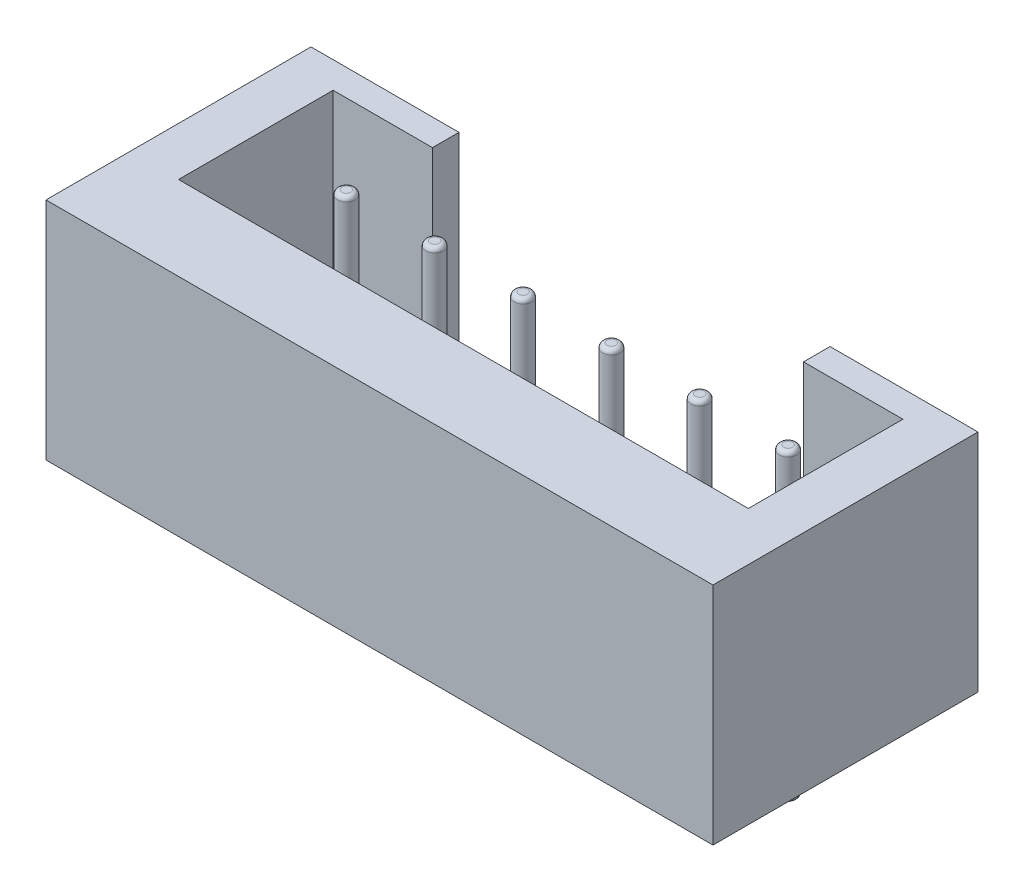
ISO-10303-21;
HEADER;
FILE_DESCRIPTION(('STEP AP214'),'2;1');
FILE_NAME('part.step','',(''),(''),'','','');
FILE_SCHEMA(('AUTOMOTIVE_DESIGN { 1 0 10303 214 1 1 1 1 }'));
ENDSEC;
DATA;
#1=APPLICATION_CONTEXT('core data for automotive mechanical design processes');
#2=APPLICATION_PROTOCOL_DEFINITION('international standard','automotive_design',2000,#1);
#3=PRODUCT_CONTEXT('',#1,'mechanical');
#4=PRODUCT('Part','Part','',(#3));
#5=PRODUCT_RELATED_PRODUCT_CATEGORY('part','',(#4));
#6=PRODUCT_DEFINITION_FORMATION('','',#4);
#7=PRODUCT_DEFINITION_CONTEXT('part definition',#1,'design');
#8=PRODUCT_DEFINITION('design','',#6,#7);
#9=PRODUCT_DEFINITION_SHAPE('','',#8);
#10=(LENGTH_UNIT() NAMED_UNIT(*) SI_UNIT(.MILLI.,.METRE.));
#11=(NAMED_UNIT(*) PLANE_ANGLE_UNIT() SI_UNIT($,.RADIAN.));
#12=(NAMED_UNIT(*) SI_UNIT($,.STERADIAN.) SOLID_ANGLE_UNIT());
#13=UNCERTAINTY_MEASURE_WITH_UNIT(LENGTH_MEASURE(1.E-05),#10,'distance_accuracy_value','');
#14=(GEOMETRIC_REPRESENTATION_CONTEXT(3) GLOBAL_UNCERTAINTY_ASSIGNED_CONTEXT((#13)) GLOBAL_UNIT_ASSIGNED_CONTEXT((#10,
#11,#12)) REPRESENTATION_CONTEXT('',''));
#15=CARTESIAN_POINT('',(0.,0.,0.));
#16=DIRECTION('',(0.,0.,1.));
#17=DIRECTION('',(1.,0.,0.));
#18=AXIS2_PLACEMENT_3D('',#15,#16,#17);
#19=CARTESIAN_POINT('',(-7.55,0.6,-3.));
#20=DIRECTION('',(1.,0.,0.));
#21=DIRECTION('',(0.,0.,-1.));
#22=AXIS2_PLACEMENT_3D('',#19,#20,#21);
#23=PLANE('',#22);
#24=DIRECTION('',(0.,0.,1.));
#25=VECTOR('',#24,1.);
#26=CARTESIAN_POINT('',(-7.55,0.,-3.));
#27=LINE('',#26,#25);
#28=CARTESIAN_POINT('',(-7.55,0.,-3.));
#29=VERTEX_POINT('',#28);
#30=CARTESIAN_POINT('',(-7.55,0.,3.));
#31=VERTEX_POINT('',#30);
#32=EDGE_CURVE('E220',#29,#31,#27,.T.);
#33=ORIENTED_EDGE('',*,*,#32,.T.);
#34=DIRECTION('',(0.,-1.,0.));
#35=VECTOR('',#34,1.);
#36=CARTESIAN_POINT('',(-7.55,0.6,3.));
#37=LINE('',#36,#35);
#38=CARTESIAN_POINT('',(-7.55,5.1,3.));
#39=VERTEX_POINT('',#38);
#40=EDGE_CURVE('E265',#39,#31,#37,.T.);
#41=ORIENTED_EDGE('',*,*,#40,.F.);
#42=DIRECTION('',(0.,0.,1.));
#43=VECTOR('',#42,1.);
#44=CARTESIAN_POINT('',(-7.55,5.1,0.));
#45=LINE('',#44,#43);
#46=CARTESIAN_POINT('',(-7.55,5.1,-3.));
#47=VERTEX_POINT('',#46);
#48=EDGE_CURVE('E194',#47,#39,#45,.T.);
#49=ORIENTED_EDGE('',*,*,#48,.F.);
#50=DIRECTION('',(0.,-1.,0.));
#51=VECTOR('',#50,1.);
#52=CARTESIAN_POINT('',(-7.55,0.6,-3.));
#53=LINE('',#52,#51);
#54=EDGE_CURVE('E269',#47,#29,#53,.T.);
#55=ORIENTED_EDGE('',*,*,#54,.T.);
#56=EDGE_LOOP('',(#33,#41,#49,#55));
#57=FACE_BOUND('',#56,.T.);
#58=ADVANCED_FACE('F45',(#57),#23,.F.);
#59=CARTESIAN_POINT('',(-7.55,0.6,3.));
#60=DIRECTION('',(0.,0.,-1.));
#61=DIRECTION('',(-1.,0.,0.));
#62=AXIS2_PLACEMENT_3D('',#59,#60,#61);
#63=PLANE('',#62);
#64=DIRECTION('',(1.,0.,0.));
#65=VECTOR('',#64,1.);
#66=CARTESIAN_POINT('',(-7.55,0.,3.));
#67=LINE('',#66,#65);
#68=CARTESIAN_POINT('',(7.55,0.,3.));
#69=VERTEX_POINT('',#68);
#70=EDGE_CURVE('E250',#31,#69,#67,.T.);
#71=ORIENTED_EDGE('',*,*,#70,.T.);
#72=DIRECTION('',(0.,-1.,0.));
#73=VECTOR('',#72,1.);
#74=CARTESIAN_POINT('',(7.55,0.6,3.));
#75=LINE('',#74,#73);
#76=CARTESIAN_POINT('',(7.55,5.1,3.));
#77=VERTEX_POINT('',#76);
#78=EDGE_CURVE('E261',#77,#69,#75,.T.);
#79=ORIENTED_EDGE('',*,*,#78,.F.);
#80=DIRECTION('',(1.,0.,0.));
#81=VECTOR('',#80,1.);
#82=CARTESIAN_POINT('',(0.,5.1,3.));
#83=LINE('',#82,#81);
#84=EDGE_CURVE('E190',#39,#77,#83,.T.);
#85=ORIENTED_EDGE('',*,*,#84,.F.);
#86=ORIENTED_EDGE('',*,*,#40,.T.);
#87=EDGE_LOOP('',(#71,#79,#85,#86));
#88=FACE_BOUND('',#87,.T.);
#89=ADVANCED_FACE('F400',(#88),#63,.F.);
#90=CARTESIAN_POINT('',(7.55,0.6,-3.));
#91=DIRECTION('',(-1.,0.,0.));
#92=DIRECTION('',(0.,0.,1.));
#93=AXIS2_PLACEMENT_3D('',#90,#91,#92);
#94=PLANE('',#93);
#95=DIRECTION('',(0.,0.,-1.));
#96=VECTOR('',#95,1.);
#97=CARTESIAN_POINT('',(7.55,0.,-3.));
#98=LINE('',#97,#96);
#99=CARTESIAN_POINT('',(7.55,0.,-3.));
#100=VERTEX_POINT('',#99);
#101=EDGE_CURVE('E253',#69,#100,#98,.T.);
#102=ORIENTED_EDGE('',*,*,#101,.T.);
#103=DIRECTION('',(0.,-1.,0.));
#104=VECTOR('',#103,1.);
#105=CARTESIAN_POINT('',(7.55,0.6,-3.));
#106=LINE('',#105,#104);
#107=CARTESIAN_POINT('',(7.55,5.1,-3.));
#108=VERTEX_POINT('',#107);
#109=EDGE_CURVE('E246',#108,#100,#106,.T.);
#110=ORIENTED_EDGE('',*,*,#109,.F.);
#111=DIRECTION('',(0.,0.,1.));
#112=VECTOR('',#111,1.);
#113=CARTESIAN_POINT('',(7.55,5.1,0.));
#114=LINE('',#113,#112);
#115=EDGE_CURVE('E186',#108,#77,#114,.T.);
#116=ORIENTED_EDGE('',*,*,#115,.T.);
#117=ORIENTED_EDGE('',*,*,#78,.T.);
#118=EDGE_LOOP('',(#102,#110,#116,#117));
#119=FACE_BOUND('',#118,.T.);
#120=ADVANCED_FACE('F406',(#119),#94,.F.);
#121=CARTESIAN_POINT('',(4.2,0.6,-3.));
#122=DIRECTION('',(0.,0.,1.));
#123=DIRECTION('',(1.,0.,0.));
#124=AXIS2_PLACEMENT_3D('',#121,#122,#123);
#125=PLANE('',#124);
#126=DIRECTION('',(-1.,0.,0.));
#127=VECTOR('',#126,1.);
#128=CARTESIAN_POINT('',(4.2,0.,-3.));
#129=LINE('',#128,#127);
#130=EDGE_CURVE('E247',#100,#29,#129,.T.);
#131=ORIENTED_EDGE('',*,*,#130,.T.);
#132=ORIENTED_EDGE('',*,*,#54,.F.);
#133=DIRECTION('',(1.,0.,0.));
#134=VECTOR('',#133,1.);
#135=CARTESIAN_POINT('',(0.,5.1,-3.));
#136=LINE('',#135,#134);
#137=CARTESIAN_POINT('',(-4.2,5.1,-3.));
#138=VERTEX_POINT('',#137);
#139=EDGE_CURVE('E141',#47,#138,#136,.T.);
#140=ORIENTED_EDGE('',*,*,#139,.T.);
#141=DIRECTION('',(0.,-1.,0.));
#142=VECTOR('',#141,1.);
#143=CARTESIAN_POINT('',(-4.2,5.1,-3.));
#144=LINE('',#143,#142);
#145=CARTESIAN_POINT('',(-4.2,0.6,-3.));
#146=VERTEX_POINT('',#145);
#147=EDGE_CURVE('E156',#138,#146,#144,.T.);
#148=ORIENTED_EDGE('',*,*,#147,.T.);
#149=DIRECTION('',(-1.,0.,0.));
#150=VECTOR('',#149,1.);
#151=CARTESIAN_POINT('',(-4.2,0.6,-3.));
#152=LINE('',#151,#150);
#153=CARTESIAN_POINT('',(4.2,0.6,-3.));
#154=VERTEX_POINT('',#153);
#155=EDGE_CURVE('E243',#154,#146,#152,.T.);
#156=ORIENTED_EDGE('',*,*,#155,.F.);
#157=DIRECTION('',(0.,-1.,0.));
#158=VECTOR('',#157,1.);
#159=CARTESIAN_POINT('',(4.2,5.1,-3.));
#160=LINE('',#159,#158);
#161=CARTESIAN_POINT('',(4.2,5.1,-3.));
#162=VERTEX_POINT('',#161);
#163=EDGE_CURVE('E221',#162,#154,#160,.T.);
#164=ORIENTED_EDGE('',*,*,#163,.F.);
#165=DIRECTION('',(1.,0.,0.));
#166=VECTOR('',#165,1.);
#167=CARTESIAN_POINT('',(0.,5.1,-3.));
#168=LINE('',#167,#166);
#169=EDGE_CURVE('E182',#162,#108,#168,.T.);
#170=ORIENTED_EDGE('',*,*,#169,.T.);
#171=ORIENTED_EDGE('',*,*,#109,.T.);
#172=EDGE_LOOP('',(#131,#132,#140,#148,#156,#164,#170,#171));
#173=FACE_BOUND('',#172,.T.);
#174=ADVANCED_FACE('F542',(#173),#125,.F.);
#175=CARTESIAN_POINT('',(0.,0.6,0.));
#176=DIRECTION('',(0.,-1.,0.));
#177=DIRECTION('',(0.,0.,-1.));
#178=AXIS2_PLACEMENT_3D('',#175,#176,#177);
#179=PLANE('',#178);
#180=CARTESIAN_POINT('',(5.05,0.6,-1.2));
#181=DIRECTION('',(0.,-1.,0.));
#182=DIRECTION('',(0.,0.,-1.));
#183=AXIS2_PLACEMENT_3D('',#180,#181,#182);
#184=CIRCLE('',#183,0.2);
#185=CARTESIAN_POINT('',(5.05,0.6,-1.4));
#186=VERTEX_POINT('',#185);
#187=EDGE_CURVE('E1119',#186,#186,#184,.T.);
#188=ORIENTED_EDGE('',*,*,#187,.T.);
#189=EDGE_LOOP('',(#188));
#190=FACE_BOUND('',#189,.T.);
#191=CARTESIAN_POINT('',(3.05,0.6,-1.2));
#192=DIRECTION('',(0.,-1.,0.));
#193=DIRECTION('',(0.,0.,-1.));
#194=AXIS2_PLACEMENT_3D('',#191,#192,#193);
#195=CIRCLE('',#194,0.2);
#196=CARTESIAN_POINT('',(3.05,0.6,-1.4));
#197=VERTEX_POINT('',#196);
#198=EDGE_CURVE('E1121',#197,#197,#195,.T.);
#199=ORIENTED_EDGE('',*,*,#198,.T.);
#200=EDGE_LOOP('',(#199));
#201=FACE_BOUND('',#200,.T.);
#202=CARTESIAN_POINT('',(1.05,0.6,-1.2));
#203=DIRECTION('',(0.,-1.,0.));
#204=DIRECTION('',(0.,0.,-1.));
#205=AXIS2_PLACEMENT_3D('',#202,#203,#204);
#206=CIRCLE('',#205,0.2);
#207=CARTESIAN_POINT('',(1.05,0.6,-1.4));
#208=VERTEX_POINT('',#207);
#209=EDGE_CURVE('E1125',#208,#208,#206,.T.);
#210=ORIENTED_EDGE('',*,*,#209,.T.);
#211=EDGE_LOOP('',(#210));
#212=FACE_BOUND('',#211,.T.);
#213=CARTESIAN_POINT('',(-0.950000000000003,0.6,-1.2));
#214=DIRECTION('',(0.,-1.,0.));
#215=DIRECTION('',(0.,0.,-1.));
#216=AXIS2_PLACEMENT_3D('',#213,#214,#215);
#217=CIRCLE('',#216,0.2);
#218=CARTESIAN_POINT('',(-0.950000000000003,0.6,-1.4));
#219=VERTEX_POINT('',#218);
#220=EDGE_CURVE('E1131',#219,#219,#217,.T.);
#221=ORIENTED_EDGE('',*,*,#220,.T.);
#222=EDGE_LOOP('',(#221));
#223=FACE_BOUND('',#222,.T.);
#224=CARTESIAN_POINT('',(-2.95,0.6,-1.2));
#225=DIRECTION('',(0.,-1.,0.));
#226=DIRECTION('',(0.,0.,-1.));
#227=AXIS2_PLACEMENT_3D('',#224,#225,#226);
#228=CIRCLE('',#227,0.2);
#229=CARTESIAN_POINT('',(-2.95,0.6,-1.4));
#230=VERTEX_POINT('',#229);
#231=EDGE_CURVE('E1134',#230,#230,#228,.T.);
#232=ORIENTED_EDGE('',*,*,#231,.T.);
#233=EDGE_LOOP('',(#232));
#234=FACE_BOUND('',#233,.T.);
#235=CARTESIAN_POINT('',(-4.95,0.6,-1.2));
#236=DIRECTION('',(0.,-1.,0.));
#237=DIRECTION('',(0.,0.,-1.));
#238=AXIS2_PLACEMENT_3D('',#235,#236,#237);
#239=CIRCLE('',#238,0.2);
#240=CARTESIAN_POINT('',(-4.95,0.6,-1.4));
#241=VERTEX_POINT('',#240);
#242=EDGE_CURVE('E165',#241,#241,#239,.T.);
#243=ORIENTED_EDGE('',*,*,#242,.T.);
#244=EDGE_LOOP('',(#243));
#245=FACE_BOUND('',#244,.T.);
#246=ORIENTED_EDGE('',*,*,#155,.T.);
#247=DIRECTION('',(0.,0.,1.));
#248=VECTOR('',#247,1.);
#249=CARTESIAN_POINT('',(-4.2,0.6,0.));
#250=LINE('',#249,#248);
#251=CARTESIAN_POINT('',(-4.2,0.6,-2.4));
#252=VERTEX_POINT('',#251);
#253=EDGE_CURVE('E61',#146,#252,#250,.T.);
#254=ORIENTED_EDGE('',*,*,#253,.T.);
#255=DIRECTION('',(-1.,0.,0.));
#256=VECTOR('',#255,1.);
#257=CARTESIAN_POINT('',(0.,0.6,-2.4));
#258=LINE('',#257,#256);
#259=CARTESIAN_POINT('',(-6.45,0.6,-2.4));
#260=VERTEX_POINT('',#259);
#261=EDGE_CURVE('E66',#252,#260,#258,.T.);
#262=ORIENTED_EDGE('',*,*,#261,.T.);
#263=DIRECTION('',(0.,0.,1.));
#264=VECTOR('',#263,1.);
#265=CARTESIAN_POINT('',(-6.45,0.6,0.));
#266=LINE('',#265,#264);
#267=CARTESIAN_POINT('',(-6.45,0.6,1.1));
#268=VERTEX_POINT('',#267);
#269=EDGE_CURVE('E204',#260,#268,#266,.T.);
#270=ORIENTED_EDGE('',*,*,#269,.T.);
#271=DIRECTION('',(-1.,0.,0.));
#272=VECTOR('',#271,1.);
#273=CARTESIAN_POINT('',(0.,0.6,1.1));
#274=LINE('',#273,#272);
#275=CARTESIAN_POINT('',(6.45,0.6,1.1));
#276=VERTEX_POINT('',#275);
#277=EDGE_CURVE('E207',#276,#268,#274,.T.);
#278=ORIENTED_EDGE('',*,*,#277,.F.);
#279=DIRECTION('',(0.,0.,1.));
#280=VECTOR('',#279,1.);
#281=CARTESIAN_POINT('',(6.45,0.6,0.));
#282=LINE('',#281,#280);
#283=CARTESIAN_POINT('',(6.45,0.6,-2.4));
#284=VERTEX_POINT('',#283);
#285=EDGE_CURVE('E211',#284,#276,#282,.T.);
#286=ORIENTED_EDGE('',*,*,#285,.F.);
#287=DIRECTION('',(1.,0.,0.));
#288=VECTOR('',#287,1.);
#289=CARTESIAN_POINT('',(0.,0.6,-2.4));
#290=LINE('',#289,#288);
#291=CARTESIAN_POINT('',(4.2,0.6,-2.4));
#292=VERTEX_POINT('',#291);
#293=EDGE_CURVE('E162',#292,#284,#290,.T.);
#294=ORIENTED_EDGE('',*,*,#293,.F.);
#295=DIRECTION('',(0.,0.,1.));
#296=VECTOR('',#295,1.);
#297=CARTESIAN_POINT('',(4.2,0.6,0.));
#298=LINE('',#297,#296);
#299=EDGE_CURVE('E158',#154,#292,#298,.T.);
#300=ORIENTED_EDGE('',*,*,#299,.F.);
#301=EDGE_LOOP('',(#246,#254,#262,#270,#278,#286,#294,#300));
#302=FACE_BOUND('',#301,.T.);
#303=ADVANCED_FACE('F539',(#190,#201,#212,#223,#234,#245,#302),#179,.F.);
#304=CARTESIAN_POINT('',(0.,0.,0.));
#305=DIRECTION('',(0.,-1.,0.));
#306=DIRECTION('',(0.,0.,-1.));
#307=AXIS2_PLACEMENT_3D('',#304,#305,#306);
#308=PLANE('',#307);
#309=CARTESIAN_POINT('',(5.05,0.,-1.2));
#310=DIRECTION('',(0.,-1.,0.));
#311=DIRECTION('',(0.,0.,-1.));
#312=AXIS2_PLACEMENT_3D('',#309,#310,#311);
#313=CIRCLE('',#312,0.2);
#314=CARTESIAN_POINT('',(5.05,0.,-1.4));
#315=VERTEX_POINT('',#314);
#316=EDGE_CURVE('E293',#315,#315,#313,.T.);
#317=ORIENTED_EDGE('',*,*,#316,.F.);
#318=EDGE_LOOP('',(#317));
#319=FACE_BOUND('',#318,.T.);
#320=CARTESIAN_POINT('',(3.05,0.,-1.2));
#321=DIRECTION('',(0.,-1.,0.));
#322=DIRECTION('',(0.,0.,-1.));
#323=AXIS2_PLACEMENT_3D('',#320,#321,#322);
#324=CIRCLE('',#323,0.2);
#325=CARTESIAN_POINT('',(3.05,0.,-1.4));
#326=VERTEX_POINT('',#325);
#327=EDGE_CURVE('E289',#326,#326,#324,.T.);
#328=ORIENTED_EDGE('',*,*,#327,.F.);
#329=EDGE_LOOP('',(#328));
#330=FACE_BOUND('',#329,.T.);
#331=CARTESIAN_POINT('',(1.05,0.,-1.2));
#332=DIRECTION('',(0.,-1.,0.));
#333=DIRECTION('',(0.,0.,-1.));
#334=AXIS2_PLACEMENT_3D('',#331,#332,#333);
#335=CIRCLE('',#334,0.2);
#336=CARTESIAN_POINT('',(1.05,0.,-1.4));
#337=VERTEX_POINT('',#336);
#338=EDGE_CURVE('E285',#337,#337,#335,.T.);
#339=ORIENTED_EDGE('',*,*,#338,.F.);
#340=EDGE_LOOP('',(#339));
#341=FACE_BOUND('',#340,.T.);
#342=CARTESIAN_POINT('',(-0.950000000000003,0.,-1.2));
#343=DIRECTION('',(0.,-1.,0.));
#344=DIRECTION('',(0.,0.,-1.));
#345=AXIS2_PLACEMENT_3D('',#342,#343,#344);
#346=CIRCLE('',#345,0.2);
#347=CARTESIAN_POINT('',(-0.950000000000003,0.,-1.4));
#348=VERTEX_POINT('',#347);
#349=EDGE_CURVE('E281',#348,#348,#346,.T.);
#350=ORIENTED_EDGE('',*,*,#349,.F.);
#351=EDGE_LOOP('',(#350));
#352=FACE_BOUND('',#351,.T.);
#353=CARTESIAN_POINT('',(-2.95,0.,-1.2));
#354=DIRECTION('',(0.,-1.,0.));
#355=DIRECTION('',(0.,0.,-1.));
#356=AXIS2_PLACEMENT_3D('',#353,#354,#355);
#357=CIRCLE('',#356,0.2);
#358=CARTESIAN_POINT('',(-2.95,0.,-1.4));
#359=VERTEX_POINT('',#358);
#360=EDGE_CURVE('E277',#359,#359,#357,.T.);
#361=ORIENTED_EDGE('',*,*,#360,.F.);
#362=EDGE_LOOP('',(#361));
#363=FACE_BOUND('',#362,.T.);
#364=CARTESIAN_POINT('',(-4.95,0.,-1.2));
#365=DIRECTION('',(0.,-1.,0.));
#366=DIRECTION('',(0.,0.,-1.));
#367=AXIS2_PLACEMENT_3D('',#364,#365,#366);
#368=CIRCLE('',#367,0.2);
#369=CARTESIAN_POINT('',(-4.95,0.,-1.4));
#370=VERTEX_POINT('',#369);
#371=EDGE_CURVE('E273',#370,#370,#368,.T.);
#372=ORIENTED_EDGE('',*,*,#371,.F.);
#373=EDGE_LOOP('',(#372));
#374=FACE_BOUND('',#373,.T.);
#375=ORIENTED_EDGE('',*,*,#32,.F.);
#376=ORIENTED_EDGE('',*,*,#130,.F.);
#377=ORIENTED_EDGE('',*,*,#101,.F.);
#378=ORIENTED_EDGE('',*,*,#70,.F.);
#379=EDGE_LOOP('',(#375,#376,#377,#378));
#380=FACE_BOUND('',#379,.T.);
#381=ADVANCED_FACE('F538',(#319,#330,#341,#352,#363,#374,#380),#308,.T.);
#382=CARTESIAN_POINT('',(-4.2,5.1,0.));
#383=DIRECTION('',(1.,0.,0.));
#384=DIRECTION('',(0.,0.,-1.));
#385=AXIS2_PLACEMENT_3D('',#382,#383,#384);
#386=PLANE('',#385);
#387=ORIENTED_EDGE('',*,*,#253,.F.);
#388=ORIENTED_EDGE('',*,*,#147,.F.);
#389=DIRECTION('',(0.,0.,1.));
#390=VECTOR('',#389,1.);
#391=CARTESIAN_POINT('',(-4.2,5.1,0.));
#392=LINE('',#391,#390);
#393=CARTESIAN_POINT('',(-4.2,5.1,-2.4));
#394=VERTEX_POINT('',#393);
#395=EDGE_CURVE('E148',#138,#394,#392,.T.);
#396=ORIENTED_EDGE('',*,*,#395,.T.);
#397=DIRECTION('',(0.,-1.,0.));
#398=VECTOR('',#397,1.);
#399=CARTESIAN_POINT('',(-4.2,5.1,-2.4));
#400=LINE('',#399,#398);
#401=EDGE_CURVE('E133',#394,#252,#400,.T.);
#402=ORIENTED_EDGE('',*,*,#401,.T.);
#403=EDGE_LOOP('',(#387,#388,#396,#402));
#404=FACE_BOUND('',#403,.T.);
#405=ADVANCED_FACE('F154',(#404),#386,.T.);
#406=CARTESIAN_POINT('',(4.2,5.1,0.));
#407=DIRECTION('',(1.,0.,0.));
#408=DIRECTION('',(0.,0.,-1.));
#409=AXIS2_PLACEMENT_3D('',#406,#407,#408);
#410=PLANE('',#409);
#411=ORIENTED_EDGE('',*,*,#299,.T.);
#412=DIRECTION('',(0.,-1.,0.));
#413=VECTOR('',#412,1.);
#414=CARTESIAN_POINT('',(4.2,5.1,-2.4));
#415=LINE('',#414,#413);
#416=CARTESIAN_POINT('',(4.2,5.1,-2.4));
#417=VERTEX_POINT('',#416);
#418=EDGE_CURVE('E225',#417,#292,#415,.T.);
#419=ORIENTED_EDGE('',*,*,#418,.F.);
#420=DIRECTION('',(0.,0.,1.));
#421=VECTOR('',#420,1.);
#422=CARTESIAN_POINT('',(4.2,5.1,0.));
#423=LINE('',#422,#421);
#424=EDGE_CURVE('E179',#162,#417,#423,.T.);
#425=ORIENTED_EDGE('',*,*,#424,.F.);
#426=ORIENTED_EDGE('',*,*,#163,.T.);
#427=EDGE_LOOP('',(#411,#419,#425,#426));
#428=FACE_BOUND('',#427,.T.);
#429=ADVANCED_FACE('F514',(#428),#410,.F.);
#430=CARTESIAN_POINT('',(0.,5.1,-2.4));
#431=DIRECTION('',(0.,0.,-1.));
#432=DIRECTION('',(-1.,0.,0.));
#433=AXIS2_PLACEMENT_3D('',#430,#431,#432);
#434=PLANE('',#433);
#435=ORIENTED_EDGE('',*,*,#293,.T.);
#436=DIRECTION('',(0.,-1.,0.));
#437=VECTOR('',#436,1.);
#438=CARTESIAN_POINT('',(6.45,5.1,-2.4));
#439=LINE('',#438,#437);
#440=CARTESIAN_POINT('',(6.45,5.1,-2.4));
#441=VERTEX_POINT('',#440);
#442=EDGE_CURVE('E229',#441,#284,#439,.T.);
#443=ORIENTED_EDGE('',*,*,#442,.F.);
#444=DIRECTION('',(1.,0.,0.));
#445=VECTOR('',#444,1.);
#446=CARTESIAN_POINT('',(0.,5.1,-2.4));
#447=LINE('',#446,#445);
#448=EDGE_CURVE('E176',#417,#441,#447,.T.);
#449=ORIENTED_EDGE('',*,*,#448,.F.);
#450=ORIENTED_EDGE('',*,*,#418,.T.);
#451=EDGE_LOOP('',(#435,#443,#449,#450));
#452=FACE_BOUND('',#451,.T.);
#453=ADVANCED_FACE('F517',(#452),#434,.F.);
#454=CARTESIAN_POINT('',(6.45,5.1,0.));
#455=DIRECTION('',(1.,0.,0.));
#456=DIRECTION('',(0.,0.,-1.));
#457=AXIS2_PLACEMENT_3D('',#454,#455,#456);
#458=PLANE('',#457);
#459=ORIENTED_EDGE('',*,*,#285,.T.);
#460=DIRECTION('',(0.,-1.,0.));
#461=VECTOR('',#460,1.);
#462=CARTESIAN_POINT('',(6.45,5.1,1.1));
#463=LINE('',#462,#461);
#464=CARTESIAN_POINT('',(6.45,5.1,1.1));
#465=VERTEX_POINT('',#464);
#466=EDGE_CURVE('E233',#465,#276,#463,.T.);
#467=ORIENTED_EDGE('',*,*,#466,.F.);
#468=DIRECTION('',(0.,0.,1.));
#469=VECTOR('',#468,1.);
#470=CARTESIAN_POINT('',(6.45,5.1,0.));
#471=LINE('',#470,#469);
#472=EDGE_CURVE('E173',#441,#465,#471,.T.);
#473=ORIENTED_EDGE('',*,*,#472,.F.);
#474=ORIENTED_EDGE('',*,*,#442,.T.);
#475=EDGE_LOOP('',(#459,#467,#473,#474));
#476=FACE_BOUND('',#475,.T.);
#477=ADVANCED_FACE('F521',(#476),#458,.F.);
#478=CARTESIAN_POINT('',(0.,5.1,1.1));
#479=DIRECTION('',(0.,0.,1.));
#480=DIRECTION('',(1.,0.,0.));
#481=AXIS2_PLACEMENT_3D('',#478,#479,#480);
#482=PLANE('',#481);
#483=ORIENTED_EDGE('',*,*,#277,.T.);
#484=DIRECTION('',(0.,-1.,0.));
#485=VECTOR('',#484,1.);
#486=CARTESIAN_POINT('',(-6.45,5.1,1.1));
#487=LINE('',#486,#485);
#488=CARTESIAN_POINT('',(-6.45,5.1,1.1));
#489=VERTEX_POINT('',#488);
#490=EDGE_CURVE('E237',#489,#268,#487,.T.);
#491=ORIENTED_EDGE('',*,*,#490,.F.);
#492=DIRECTION('',(-1.,0.,0.));
#493=VECTOR('',#492,1.);
#494=CARTESIAN_POINT('',(0.,5.1,1.1));
#495=LINE('',#494,#493);
#496=EDGE_CURVE('E170',#465,#489,#495,.T.);
#497=ORIENTED_EDGE('',*,*,#496,.F.);
#498=ORIENTED_EDGE('',*,*,#466,.T.);
#499=EDGE_LOOP('',(#483,#491,#497,#498));
#500=FACE_BOUND('',#499,.T.);
#501=ADVANCED_FACE('F525',(#500),#482,.F.);
#502=CARTESIAN_POINT('',(-6.45,5.1,0.));
#503=DIRECTION('',(1.,0.,0.));
#504=DIRECTION('',(0.,0.,-1.));
#505=AXIS2_PLACEMENT_3D('',#502,#503,#504);
#506=PLANE('',#505);
#507=ORIENTED_EDGE('',*,*,#269,.F.);
#508=DIRECTION('',(0.,-1.,0.));
#509=VECTOR('',#508,1.);
#510=CARTESIAN_POINT('',(-6.45,5.1,-2.4));
#511=LINE('',#510,#509);
#512=CARTESIAN_POINT('',(-6.45,5.1,-2.4));
#513=VERTEX_POINT('',#512);
#514=EDGE_CURVE('E140',#513,#260,#511,.T.);
#515=ORIENTED_EDGE('',*,*,#514,.F.);
#516=DIRECTION('',(0.,0.,1.));
#517=VECTOR('',#516,1.);
#518=CARTESIAN_POINT('',(-6.45,5.1,0.));
#519=LINE('',#518,#517);
#520=EDGE_CURVE('E151',#513,#489,#519,.T.);
#521=ORIENTED_EDGE('',*,*,#520,.T.);
#522=ORIENTED_EDGE('',*,*,#490,.T.);
#523=EDGE_LOOP('',(#507,#515,#521,#522));
#524=FACE_BOUND('',#523,.T.);
#525=ADVANCED_FACE('F529',(#524),#506,.T.);
#526=CARTESIAN_POINT('',(0.,5.1,-2.4));
#527=DIRECTION('',(0.,0.,1.));
#528=DIRECTION('',(1.,0.,0.));
#529=AXIS2_PLACEMENT_3D('',#526,#527,#528);
#530=PLANE('',#529);
#531=ORIENTED_EDGE('',*,*,#261,.F.);
#532=ORIENTED_EDGE('',*,*,#401,.F.);
#533=DIRECTION('',(-1.,0.,0.));
#534=VECTOR('',#533,1.);
#535=CARTESIAN_POINT('',(0.,5.1,-2.4));
#536=LINE('',#535,#534);
#537=EDGE_CURVE('E136',#394,#513,#536,.T.);
#538=ORIENTED_EDGE('',*,*,#537,.T.);
#539=ORIENTED_EDGE('',*,*,#514,.T.);
#540=EDGE_LOOP('',(#531,#532,#538,#539));
#541=FACE_BOUND('',#540,.T.);
#542=ADVANCED_FACE('F135',(#541),#530,.T.);
#543=CARTESIAN_POINT('',(0.,5.1,0.));
#544=DIRECTION('',(0.,-1.,0.));
#545=DIRECTION('',(0.,0.,-1.));
#546=AXIS2_PLACEMENT_3D('',#543,#544,#545);
#547=PLANE('',#546);
#548=ORIENTED_EDGE('',*,*,#395,.F.);
#549=ORIENTED_EDGE('',*,*,#139,.F.);
#550=ORIENTED_EDGE('',*,*,#48,.T.);
#551=ORIENTED_EDGE('',*,*,#84,.T.);
#552=ORIENTED_EDGE('',*,*,#115,.F.);
#553=ORIENTED_EDGE('',*,*,#169,.F.);
#554=ORIENTED_EDGE('',*,*,#424,.T.);
#555=ORIENTED_EDGE('',*,*,#448,.T.);
#556=ORIENTED_EDGE('',*,*,#472,.T.);
#557=ORIENTED_EDGE('',*,*,#496,.T.);
#558=ORIENTED_EDGE('',*,*,#520,.F.);
#559=ORIENTED_EDGE('',*,*,#537,.F.);
#560=EDGE_LOOP('',(#548,#549,#550,#551,#552,#553,#554,#555,#556,#557,#558,#559));
#561=FACE_BOUND('',#560,.T.);
#562=ADVANCED_FACE('F146',(#561),#547,.F.);
#563=CARTESIAN_POINT('',(-4.95,-2.4,-1.2));
#564=DIRECTION('',(0.,1.,0.));
#565=DIRECTION('',(0.,0.,1.));
#566=AXIS2_PLACEMENT_3D('',#563,#564,#565);
#567=PLANE('',#566);
#568=CARTESIAN_POINT('',(-4.95,-2.4,-1.2));
#569=DIRECTION('',(0.,1.,0.));
#570=DIRECTION('',(0.,0.,1.));
#571=AXIS2_PLACEMENT_3D('',#568,#569,#570);
#572=CIRCLE('',#571,0.0999999999999997);
#573=CARTESIAN_POINT('',(-4.95,-2.4,-1.1));
#574=VERTEX_POINT('',#573);
#575=EDGE_CURVE('E301',#574,#574,#572,.F.);
#576=ORIENTED_EDGE('',*,*,#575,.T.);
#577=EDGE_LOOP('',(#576));
#578=FACE_BOUND('',#577,.T.);
#579=ADVANCED_FACE('F504',(#578),#567,.F.);
#580=CARTESIAN_POINT('',(-4.95,-2.4,-1.2));
#581=DIRECTION('',(0.,1.,0.));
#582=DIRECTION('',(0.,0.,1.));
#583=AXIS2_PLACEMENT_3D('',#580,#581,#582);
#584=CYLINDRICAL_SURFACE('',#583,0.2);
#585=CARTESIAN_POINT('',(-4.95,-2.3,-1.2));
#586=DIRECTION('',(0.,1.,0.));
#587=DIRECTION('',(0.,0.,1.));
#588=AXIS2_PLACEMENT_3D('',#585,#586,#587);
#589=CIRCLE('',#588,0.2);
#590=CARTESIAN_POINT('',(-4.95,-2.3,-1.));
#591=VERTEX_POINT('',#590);
#592=EDGE_CURVE('E297',#591,#591,#589,.T.);
#593=ORIENTED_EDGE('',*,*,#592,.T.);
#594=EDGE_LOOP('',(#593));
#595=FACE_BOUND('',#594,.T.);
#596=ORIENTED_EDGE('',*,*,#371,.T.);
#597=EDGE_LOOP('',(#596));
#598=FACE_BOUND('',#597,.T.);
#599=ADVANCED_FACE('F507',(#595,#598),#584,.T.);
#600=CARTESIAN_POINT('',(-4.95,4.4,-1.2));
#601=DIRECTION('',(0.,1.,0.));
#602=DIRECTION('',(0.,0.,1.));
#603=AXIS2_PLACEMENT_3D('',#600,#601,#602);
#604=CIRCLE('',#603,0.2);
#605=CARTESIAN_POINT('',(-4.95,4.4,-1.));
#606=VERTEX_POINT('',#605);
#607=EDGE_CURVE('E349',#606,#606,#604,.F.);
#608=ORIENTED_EDGE('',*,*,#607,.T.);
#609=EDGE_LOOP('',(#608));
#610=FACE_BOUND('',#609,.T.);
#611=ORIENTED_EDGE('',*,*,#242,.F.);
#612=EDGE_LOOP('',(#611));
#613=FACE_BOUND('',#612,.T.);
#614=ADVANCED_FACE('F502',(#610,#613),#584,.T.);
#615=CARTESIAN_POINT('',(-4.95,4.5,-1.2));
#616=DIRECTION('',(0.,1.,0.));
#617=DIRECTION('',(0.,0.,1.));
#618=AXIS2_PLACEMENT_3D('',#615,#616,#617);
#619=PLANE('',#618);
#620=CARTESIAN_POINT('',(-4.95,4.5,-1.2));
#621=DIRECTION('',(0.,1.,0.));
#622=DIRECTION('',(0.,0.,1.));
#623=AXIS2_PLACEMENT_3D('',#620,#621,#622);
#624=CIRCLE('',#623,0.0999999999999997);
#625=CARTESIAN_POINT('',(-4.95,4.5,-1.1));
#626=VERTEX_POINT('',#625);
#627=EDGE_CURVE('E345',#626,#626,#624,.T.);
#628=ORIENTED_EDGE('',*,*,#627,.T.);
#629=EDGE_LOOP('',(#628));
#630=FACE_BOUND('',#629,.T.);
#631=ADVANCED_FACE('F495',(#630),#619,.T.);
#632=CARTESIAN_POINT('',(-2.95,-2.4,-1.2));
#633=DIRECTION('',(0.,1.,0.));
#634=DIRECTION('',(0.,0.,1.));
#635=AXIS2_PLACEMENT_3D('',#632,#633,#634);
#636=PLANE('',#635);
#637=CARTESIAN_POINT('',(-2.95,-2.4,-1.2));
#638=DIRECTION('',(0.,1.,0.));
#639=DIRECTION('',(0.,0.,1.));
#640=AXIS2_PLACEMENT_3D('',#637,#638,#639);
#641=CIRCLE('',#640,0.0999999999999997);
#642=CARTESIAN_POINT('',(-2.95,-2.4,-1.1));
#643=VERTEX_POINT('',#642);
#644=EDGE_CURVE('E309',#643,#643,#641,.F.);
#645=ORIENTED_EDGE('',*,*,#644,.T.);
#646=EDGE_LOOP('',(#645));
#647=FACE_BOUND('',#646,.T.);
#648=ADVANCED_FACE('F491',(#647),#636,.F.);
#649=CARTESIAN_POINT('',(-2.95,-2.4,-1.2));
#650=DIRECTION('',(0.,1.,0.));
#651=DIRECTION('',(0.,0.,1.));
#652=AXIS2_PLACEMENT_3D('',#649,#650,#651);
#653=CYLINDRICAL_SURFACE('',#652,0.2);
#654=CARTESIAN_POINT('',(-2.95,-2.3,-1.2));
#655=DIRECTION('',(0.,1.,0.));
#656=DIRECTION('',(0.,0.,1.));
#657=AXIS2_PLACEMENT_3D('',#654,#655,#656);
#658=CIRCLE('',#657,0.2);
#659=CARTESIAN_POINT('',(-2.95,-2.3,-1.));
#660=VERTEX_POINT('',#659);
#661=EDGE_CURVE('E305',#660,#660,#658,.T.);
#662=ORIENTED_EDGE('',*,*,#661,.T.);
#663=EDGE_LOOP('',(#662));
#664=FACE_BOUND('',#663,.T.);
#665=ORIENTED_EDGE('',*,*,#360,.T.);
#666=EDGE_LOOP('',(#665));
#667=FACE_BOUND('',#666,.T.);
#668=ADVANCED_FACE('F487',(#664,#667),#653,.T.);
#669=CARTESIAN_POINT('',(-2.95,4.4,-1.2));
#670=DIRECTION('',(0.,1.,0.));
#671=DIRECTION('',(0.,0.,1.));
#672=AXIS2_PLACEMENT_3D('',#669,#670,#671);
#673=CIRCLE('',#672,0.2);
#674=CARTESIAN_POINT('',(-2.95,4.4,-1.));
#675=VERTEX_POINT('',#674);
#676=EDGE_CURVE('E357',#675,#675,#673,.F.);
#677=ORIENTED_EDGE('',*,*,#676,.T.);
#678=EDGE_LOOP('',(#677));
#679=FACE_BOUND('',#678,.T.);
#680=ORIENTED_EDGE('',*,*,#231,.F.);
#681=EDGE_LOOP('',(#680));
#682=FACE_BOUND('',#681,.T.);
#683=ADVANCED_FACE('F490',(#679,#682),#653,.T.);
#684=CARTESIAN_POINT('',(-2.95,4.5,-1.2));
#685=DIRECTION('',(0.,1.,0.));
#686=DIRECTION('',(0.,0.,1.));
#687=AXIS2_PLACEMENT_3D('',#684,#685,#686);
#688=PLANE('',#687);
#689=CARTESIAN_POINT('',(-2.95,4.5,-1.2));
#690=DIRECTION('',(0.,1.,0.));
#691=DIRECTION('',(0.,0.,1.));
#692=AXIS2_PLACEMENT_3D('',#689,#690,#691);
#693=CIRCLE('',#692,0.0999999999999997);
#694=CARTESIAN_POINT('',(-2.95,4.5,-1.1));
#695=VERTEX_POINT('',#694);
#696=EDGE_CURVE('E353',#695,#695,#693,.T.);
#697=ORIENTED_EDGE('',*,*,#696,.T.);
#698=EDGE_LOOP('',(#697));
#699=FACE_BOUND('',#698,.T.);
#700=ADVANCED_FACE('F481',(#699),#688,.T.);
#701=CARTESIAN_POINT('',(-0.950000000000003,-2.4,-1.2));
#702=DIRECTION('',(0.,1.,0.));
#703=DIRECTION('',(0.,0.,1.));
#704=AXIS2_PLACEMENT_3D('',#701,#702,#703);
#705=PLANE('',#704);
#706=CARTESIAN_POINT('',(-0.950000000000003,-2.4,-1.2));
#707=DIRECTION('',(0.,1.,0.));
#708=DIRECTION('',(0.,0.,1.));
#709=AXIS2_PLACEMENT_3D('',#706,#707,#708);
#710=CIRCLE('',#709,0.0999999999999997);
#711=CARTESIAN_POINT('',(-0.950000000000003,-2.4,-1.1));
#712=VERTEX_POINT('',#711);
#713=EDGE_CURVE('E317',#712,#712,#710,.F.);
#714=ORIENTED_EDGE('',*,*,#713,.T.);
#715=EDGE_LOOP('',(#714));
#716=FACE_BOUND('',#715,.T.);
#717=ADVANCED_FACE('F477',(#716),#705,.F.);
#718=CARTESIAN_POINT('',(-0.950000000000003,-2.4,-1.2));
#719=DIRECTION('',(0.,1.,0.));
#720=DIRECTION('',(0.,0.,1.));
#721=AXIS2_PLACEMENT_3D('',#718,#719,#720);
#722=CYLINDRICAL_SURFACE('',#721,0.2);
#723=CARTESIAN_POINT('',(-0.950000000000003,-2.3,-1.2));
#724=DIRECTION('',(0.,1.,0.));
#725=DIRECTION('',(0.,0.,1.));
#726=AXIS2_PLACEMENT_3D('',#723,#724,#725);
#727=CIRCLE('',#726,0.2);
#728=CARTESIAN_POINT('',(-0.950000000000003,-2.3,-1.));
#729=VERTEX_POINT('',#728);
#730=EDGE_CURVE('E313',#729,#729,#727,.T.);
#731=ORIENTED_EDGE('',*,*,#730,.T.);
#732=EDGE_LOOP('',(#731));
#733=FACE_BOUND('',#732,.T.);
#734=ORIENTED_EDGE('',*,*,#349,.T.);
#735=EDGE_LOOP('',(#734));
#736=FACE_BOUND('',#735,.T.);
#737=ADVANCED_FACE('F473',(#733,#736),#722,.T.);
#738=CARTESIAN_POINT('',(-0.950000000000003,4.4,-1.2));
#739=DIRECTION('',(0.,1.,0.));
#740=DIRECTION('',(0.,0.,1.));
#741=AXIS2_PLACEMENT_3D('',#738,#739,#740);
#742=CIRCLE('',#741,0.2);
#743=CARTESIAN_POINT('',(-0.950000000000003,4.4,-1.));
#744=VERTEX_POINT('',#743);
#745=EDGE_CURVE('E365',#744,#744,#742,.F.);
#746=ORIENTED_EDGE('',*,*,#745,.T.);
#747=EDGE_LOOP('',(#746));
#748=FACE_BOUND('',#747,.T.);
#749=ORIENTED_EDGE('',*,*,#220,.F.);
#750=EDGE_LOOP('',(#749));
#751=FACE_BOUND('',#750,.T.);
#752=ADVANCED_FACE('F476',(#748,#751),#722,.T.);
#753=CARTESIAN_POINT('',(-0.950000000000003,4.5,-1.2));
#754=DIRECTION('',(0.,1.,0.));
#755=DIRECTION('',(0.,0.,1.));
#756=AXIS2_PLACEMENT_3D('',#753,#754,#755);
#757=PLANE('',#756);
#758=CARTESIAN_POINT('',(-0.950000000000003,4.5,-1.2));
#759=DIRECTION('',(0.,1.,0.));
#760=DIRECTION('',(0.,0.,1.));
#761=AXIS2_PLACEMENT_3D('',#758,#759,#760);
#762=CIRCLE('',#761,0.0999999999999997);
#763=CARTESIAN_POINT('',(-0.950000000000003,4.5,-1.1));
#764=VERTEX_POINT('',#763);
#765=EDGE_CURVE('E361',#764,#764,#762,.T.);
#766=ORIENTED_EDGE('',*,*,#765,.T.);
#767=EDGE_LOOP('',(#766));
#768=FACE_BOUND('',#767,.T.);
#769=ADVANCED_FACE('F483',(#768),#757,.T.);
#770=CARTESIAN_POINT('',(1.05,-2.4,-1.2));
#771=DIRECTION('',(0.,1.,0.));
#772=DIRECTION('',(0.,0.,1.));
#773=AXIS2_PLACEMENT_3D('',#770,#771,#772);
#774=PLANE('',#773);
#775=CARTESIAN_POINT('',(1.05,-2.4,-1.2));
#776=DIRECTION('',(0.,1.,0.));
#777=DIRECTION('',(0.,0.,1.));
#778=AXIS2_PLACEMENT_3D('',#775,#776,#777);
#779=CIRCLE('',#778,0.0999999999999997);
#780=CARTESIAN_POINT('',(1.05,-2.4,-1.1));
#781=VERTEX_POINT('',#780);
#782=EDGE_CURVE('E325',#781,#781,#779,.F.);
#783=ORIENTED_EDGE('',*,*,#782,.T.);
#784=EDGE_LOOP('',(#783));
#785=FACE_BOUND('',#784,.T.);
#786=ADVANCED_FACE('F472',(#785),#774,.F.);
#787=CARTESIAN_POINT('',(1.05,-2.4,-1.2));
#788=DIRECTION('',(0.,1.,0.));
#789=DIRECTION('',(0.,0.,1.));
#790=AXIS2_PLACEMENT_3D('',#787,#788,#789);
#791=CYLINDRICAL_SURFACE('',#790,0.2);
#792=CARTESIAN_POINT('',(1.05,-2.3,-1.2));
#793=DIRECTION('',(0.,1.,0.));
#794=DIRECTION('',(0.,0.,1.));
#795=AXIS2_PLACEMENT_3D('',#792,#793,#794);
#796=CIRCLE('',#795,0.2);
#797=CARTESIAN_POINT('',(1.05,-2.3,-1.));
#798=VERTEX_POINT('',#797);
#799=EDGE_CURVE('E321',#798,#798,#796,.T.);
#800=ORIENTED_EDGE('',*,*,#799,.T.);
#801=EDGE_LOOP('',(#800));
#802=FACE_BOUND('',#801,.T.);
#803=ORIENTED_EDGE('',*,*,#338,.T.);
#804=EDGE_LOOP('',(#803));
#805=FACE_BOUND('',#804,.T.);
#806=ADVANCED_FACE('F467',(#802,#805),#791,.T.);
#807=CARTESIAN_POINT('',(1.05,4.4,-1.2));
#808=DIRECTION('',(0.,1.,0.));
#809=DIRECTION('',(0.,0.,1.));
#810=AXIS2_PLACEMENT_3D('',#807,#808,#809);
#811=CIRCLE('',#810,0.2);
#812=CARTESIAN_POINT('',(1.05,4.4,-1.));
#813=VERTEX_POINT('',#812);
#814=EDGE_CURVE('E373',#813,#813,#811,.F.);
#815=ORIENTED_EDGE('',*,*,#814,.T.);
#816=EDGE_LOOP('',(#815));
#817=FACE_BOUND('',#816,.T.);
#818=ORIENTED_EDGE('',*,*,#209,.F.);
#819=EDGE_LOOP('',(#818));
#820=FACE_BOUND('',#819,.T.);
#821=ADVANCED_FACE('F458',(#817,#820),#791,.T.);
#822=CARTESIAN_POINT('',(1.05,4.5,-1.2));
#823=DIRECTION('',(0.,1.,0.));
#824=DIRECTION('',(0.,0.,1.));
#825=AXIS2_PLACEMENT_3D('',#822,#823,#824);
#826=PLANE('',#825);
#827=CARTESIAN_POINT('',(1.05,4.5,-1.2));
#828=DIRECTION('',(0.,1.,0.));
#829=DIRECTION('',(0.,0.,1.));
#830=AXIS2_PLACEMENT_3D('',#827,#828,#829);
#831=CIRCLE('',#830,0.0999999999999997);
#832=CARTESIAN_POINT('',(1.05,4.5,-1.1));
#833=VERTEX_POINT('',#832);
#834=EDGE_CURVE('E369',#833,#833,#831,.T.);
#835=ORIENTED_EDGE('',*,*,#834,.T.);
#836=EDGE_LOOP('',(#835));
#837=FACE_BOUND('',#836,.T.);
#838=ADVANCED_FACE('F455',(#837),#826,.T.);
#839=CARTESIAN_POINT('',(3.05,-2.4,-1.2));
#840=DIRECTION('',(0.,1.,0.));
#841=DIRECTION('',(0.,0.,1.));
#842=AXIS2_PLACEMENT_3D('',#839,#840,#841);
#843=PLANE('',#842);
#844=CARTESIAN_POINT('',(3.05,-2.4,-1.2));
#845=DIRECTION('',(0.,1.,0.));
#846=DIRECTION('',(0.,0.,1.));
#847=AXIS2_PLACEMENT_3D('',#844,#845,#846);
#848=CIRCLE('',#847,0.0999999999999997);
#849=CARTESIAN_POINT('',(3.05,-2.4,-1.1));
#850=VERTEX_POINT('',#849);
#851=EDGE_CURVE('E333',#850,#850,#848,.F.);
#852=ORIENTED_EDGE('',*,*,#851,.T.);
#853=EDGE_LOOP('',(#852));
#854=FACE_BOUND('',#853,.T.);
#855=ADVANCED_FACE('F457',(#854),#843,.F.);
#856=CARTESIAN_POINT('',(3.05,-2.4,-1.2));
#857=DIRECTION('',(0.,1.,0.));
#858=DIRECTION('',(0.,0.,1.));
#859=AXIS2_PLACEMENT_3D('',#856,#857,#858);
#860=CYLINDRICAL_SURFACE('',#859,0.2);
#861=CARTESIAN_POINT('',(3.05,-2.3,-1.2));
#862=DIRECTION('',(0.,1.,0.));
#863=DIRECTION('',(0.,0.,1.));
#864=AXIS2_PLACEMENT_3D('',#861,#862,#863);
#865=CIRCLE('',#864,0.2);
#866=CARTESIAN_POINT('',(3.05,-2.3,-1.));
#867=VERTEX_POINT('',#866);
#868=EDGE_CURVE('E329',#867,#867,#865,.T.);
#869=ORIENTED_EDGE('',*,*,#868,.T.);
#870=EDGE_LOOP('',(#869));
#871=FACE_BOUND('',#870,.T.);
#872=ORIENTED_EDGE('',*,*,#327,.T.);
#873=EDGE_LOOP('',(#872));
#874=FACE_BOUND('',#873,.T.);
#875=ADVANCED_FACE('F464',(#871,#874),#860,.T.);
#876=CARTESIAN_POINT('',(3.05,4.4,-1.2));
#877=DIRECTION('',(0.,1.,0.));
#878=DIRECTION('',(0.,0.,1.));
#879=AXIS2_PLACEMENT_3D('',#876,#877,#878);
#880=CIRCLE('',#879,0.2);
#881=CARTESIAN_POINT('',(3.05,4.4,-1.));
#882=VERTEX_POINT('',#881);
#883=EDGE_CURVE('E381',#882,#882,#880,.F.);
#884=ORIENTED_EDGE('',*,*,#883,.T.);
#885=EDGE_LOOP('',(#884));
#886=FACE_BOUND('',#885,.T.);
#887=ORIENTED_EDGE('',*,*,#198,.F.);
#888=EDGE_LOOP('',(#887));
#889=FACE_BOUND('',#888,.T.);
#890=ADVANCED_FACE('F707',(#886,#889),#860,.T.);
#891=CARTESIAN_POINT('',(3.05,4.5,-1.2));
#892=DIRECTION('',(0.,1.,0.));
#893=DIRECTION('',(0.,0.,1.));
#894=AXIS2_PLACEMENT_3D('',#891,#892,#893);
#895=PLANE('',#894);
#896=CARTESIAN_POINT('',(3.05,4.5,-1.2));
#897=DIRECTION('',(0.,1.,0.));
#898=DIRECTION('',(0.,0.,1.));
#899=AXIS2_PLACEMENT_3D('',#896,#897,#898);
#900=CIRCLE('',#899,0.0999999999999997);
#901=CARTESIAN_POINT('',(3.05,4.5,-1.1));
#902=VERTEX_POINT('',#901);
#903=EDGE_CURVE('E377',#902,#902,#900,.T.);
#904=ORIENTED_EDGE('',*,*,#903,.T.);
#905=EDGE_LOOP('',(#904));
#906=FACE_BOUND('',#905,.T.);
#907=ADVANCED_FACE('F717',(#906),#895,.T.);
#908=CARTESIAN_POINT('',(5.05,-2.4,-1.2));
#909=DIRECTION('',(0.,1.,0.));
#910=DIRECTION('',(0.,0.,1.));
#911=AXIS2_PLACEMENT_3D('',#908,#909,#910);
#912=PLANE('',#911);
#913=CARTESIAN_POINT('',(5.05,-2.4,-1.2));
#914=DIRECTION('',(0.,1.,0.));
#915=DIRECTION('',(0.,0.,1.));
#916=AXIS2_PLACEMENT_3D('',#913,#914,#915);
#917=CIRCLE('',#916,0.0999999999999997);
#918=CARTESIAN_POINT('',(5.05,-2.4,-1.1));
#919=VERTEX_POINT('',#918);
#920=EDGE_CURVE('E341',#919,#919,#917,.F.);
#921=ORIENTED_EDGE('',*,*,#920,.T.);
#922=EDGE_LOOP('',(#921));
#923=FACE_BOUND('',#922,.T.);
#924=ADVANCED_FACE('F726',(#923),#912,.F.);
#925=CARTESIAN_POINT('',(5.05,-2.4,-1.2));
#926=DIRECTION('',(0.,1.,0.));
#927=DIRECTION('',(0.,0.,1.));
#928=AXIS2_PLACEMENT_3D('',#925,#926,#927);
#929=CYLINDRICAL_SURFACE('',#928,0.2);
#930=CARTESIAN_POINT('',(5.05,-2.3,-1.2));
#931=DIRECTION('',(0.,1.,0.));
#932=DIRECTION('',(0.,0.,1.));
#933=AXIS2_PLACEMENT_3D('',#930,#931,#932);
#934=CIRCLE('',#933,0.2);
#935=CARTESIAN_POINT('',(5.05,-2.3,-1.));
#936=VERTEX_POINT('',#935);
#937=EDGE_CURVE('E337',#936,#936,#934,.T.);
#938=ORIENTED_EDGE('',*,*,#937,.T.);
#939=EDGE_LOOP('',(#938));
#940=FACE_BOUND('',#939,.T.);
#941=ORIENTED_EDGE('',*,*,#316,.T.);
#942=EDGE_LOOP('',(#941));
#943=FACE_BOUND('',#942,.T.);
#944=ADVANCED_FACE('F736',(#940,#943),#929,.T.);
#945=CARTESIAN_POINT('',(5.05,4.4,-1.2));
#946=DIRECTION('',(0.,1.,0.));
#947=DIRECTION('',(0.,0.,1.));
#948=AXIS2_PLACEMENT_3D('',#945,#946,#947);
#949=CIRCLE('',#948,0.2);
#950=CARTESIAN_POINT('',(5.05,4.4,-1.));
#951=VERTEX_POINT('',#950);
#952=EDGE_CURVE('E11',#951,#951,#949,.F.);
#953=ORIENTED_EDGE('',*,*,#952,.T.);
#954=EDGE_LOOP('',(#953));
#955=FACE_BOUND('',#954,.T.);
#956=ORIENTED_EDGE('',*,*,#187,.F.);
#957=EDGE_LOOP('',(#956));
#958=FACE_BOUND('',#957,.T.);
#959=ADVANCED_FACE('F746',(#955,#958),#929,.T.);
#960=CARTESIAN_POINT('',(5.05,4.5,-1.2));
#961=DIRECTION('',(0.,1.,0.));
#962=DIRECTION('',(0.,0.,1.));
#963=AXIS2_PLACEMENT_3D('',#960,#961,#962);
#964=PLANE('',#963);
#965=CARTESIAN_POINT('',(5.05,4.5,-1.2));
#966=DIRECTION('',(0.,1.,0.));
#967=DIRECTION('',(0.,0.,1.));
#968=AXIS2_PLACEMENT_3D('',#965,#966,#967);
#969=CIRCLE('',#968,0.0999999999999997);
#970=CARTESIAN_POINT('',(5.05,4.5,-1.1));
#971=VERTEX_POINT('',#970);
#972=EDGE_CURVE('E54',#971,#971,#969,.T.);
#973=ORIENTED_EDGE('',*,*,#972,.T.);
#974=EDGE_LOOP('',(#973));
#975=FACE_BOUND('',#974,.T.);
#976=ADVANCED_FACE('F388',(#975),#964,.T.);
#977=CARTESIAN_POINT('',(-4.95,-2.3,-1.2));
#978=DIRECTION('',(0.,1.,0.));
#979=DIRECTION('',(0.,0.,1.));
#980=AXIS2_PLACEMENT_3D('',#977,#978,#979);
#981=DEGENERATE_TOROIDAL_SURFACE('',#980,0.0999999999999997,0.1,.T.);
#982=ORIENTED_EDGE('',*,*,#575,.F.);
#983=EDGE_LOOP('',(#982));
#984=FACE_BOUND('',#983,.T.);
#985=ORIENTED_EDGE('',*,*,#592,.F.);
#986=EDGE_LOOP('',(#985));
#987=FACE_BOUND('',#986,.T.);
#988=ADVANCED_FACE('F411',(#984,#987),#981,.T.);
#989=CARTESIAN_POINT('',(-2.95,-2.3,-1.2));
#990=DIRECTION('',(0.,1.,0.));
#991=DIRECTION('',(0.,0.,1.));
#992=AXIS2_PLACEMENT_3D('',#989,#990,#991);
#993=DEGENERATE_TOROIDAL_SURFACE('',#992,0.0999999999999997,0.1,.T.);
#994=ORIENTED_EDGE('',*,*,#644,.F.);
#995=EDGE_LOOP('',(#994));
#996=FACE_BOUND('',#995,.T.);
#997=ORIENTED_EDGE('',*,*,#661,.F.);
#998=EDGE_LOOP('',(#997));
#999=FACE_BOUND('',#998,.T.);
#1000=ADVANCED_FACE('F414',(#996,#999),#993,.T.);
#1001=CARTESIAN_POINT('',(-0.950000000000003,-2.3,-1.2));
#1002=DIRECTION('',(0.,1.,0.));
#1003=DIRECTION('',(0.,0.,1.));
#1004=AXIS2_PLACEMENT_3D('',#1001,#1002,#1003);
#1005=DEGENERATE_TOROIDAL_SURFACE('',#1004,0.0999999999999997,0.1,.T.);
#1006=ORIENTED_EDGE('',*,*,#713,.F.);
#1007=EDGE_LOOP('',(#1006));
#1008=FACE_BOUND('',#1007,.T.);
#1009=ORIENTED_EDGE('',*,*,#730,.F.);
#1010=EDGE_LOOP('',(#1009));
#1011=FACE_BOUND('',#1010,.T.);
#1012=ADVANCED_FACE('F418',(#1008,#1011),#1005,.T.);
#1013=CARTESIAN_POINT('',(1.05,-2.3,-1.2));
#1014=DIRECTION('',(0.,1.,0.));
#1015=DIRECTION('',(0.,0.,1.));
#1016=AXIS2_PLACEMENT_3D('',#1013,#1014,#1015);
#1017=DEGENERATE_TOROIDAL_SURFACE('',#1016,0.0999999999999997,0.1,.T.);
#1018=ORIENTED_EDGE('',*,*,#782,.F.);
#1019=EDGE_LOOP('',(#1018));
#1020=FACE_BOUND('',#1019,.T.);
#1021=ORIENTED_EDGE('',*,*,#799,.F.);
#1022=EDGE_LOOP('',(#1021));
#1023=FACE_BOUND('',#1022,.T.);
#1024=ADVANCED_FACE('F422',(#1020,#1023),#1017,.T.);
#1025=CARTESIAN_POINT('',(3.05,-2.3,-1.2));
#1026=DIRECTION('',(0.,1.,0.));
#1027=DIRECTION('',(0.,0.,1.));
#1028=AXIS2_PLACEMENT_3D('',#1025,#1026,#1027);
#1029=DEGENERATE_TOROIDAL_SURFACE('',#1028,0.0999999999999997,0.1,.T.);
#1030=ORIENTED_EDGE('',*,*,#851,.F.);
#1031=EDGE_LOOP('',(#1030));
#1032=FACE_BOUND('',#1031,.T.);
#1033=ORIENTED_EDGE('',*,*,#868,.F.);
#1034=EDGE_LOOP('',(#1033));
#1035=FACE_BOUND('',#1034,.T.);
#1036=ADVANCED_FACE('F426',(#1032,#1035),#1029,.T.);
#1037=CARTESIAN_POINT('',(5.05,-2.3,-1.2));
#1038=DIRECTION('',(0.,1.,0.));
#1039=DIRECTION('',(0.,0.,1.));
#1040=AXIS2_PLACEMENT_3D('',#1037,#1038,#1039);
#1041=DEGENERATE_TOROIDAL_SURFACE('',#1040,0.0999999999999997,0.1,.T.);
#1042=ORIENTED_EDGE('',*,*,#920,.F.);
#1043=EDGE_LOOP('',(#1042));
#1044=FACE_BOUND('',#1043,.T.);
#1045=ORIENTED_EDGE('',*,*,#937,.F.);
#1046=EDGE_LOOP('',(#1045));
#1047=FACE_BOUND('',#1046,.T.);
#1048=ADVANCED_FACE('F430',(#1044,#1047),#1041,.T.);
#1049=CARTESIAN_POINT('',(-4.95,4.4,-1.2));
#1050=DIRECTION('',(0.,1.,0.));
#1051=DIRECTION('',(0.,0.,1.));
#1052=AXIS2_PLACEMENT_3D('',#1049,#1050,#1051);
#1053=DEGENERATE_TOROIDAL_SURFACE('',#1052,0.0999999999999997,0.1,.T.);
#1054=ORIENTED_EDGE('',*,*,#607,.F.);
#1055=EDGE_LOOP('',(#1054));
#1056=FACE_BOUND('',#1055,.T.);
#1057=ORIENTED_EDGE('',*,*,#627,.F.);
#1058=EDGE_LOOP('',(#1057));
#1059=FACE_BOUND('',#1058,.T.);
#1060=ADVANCED_FACE('F434',(#1056,#1059),#1053,.T.);
#1061=CARTESIAN_POINT('',(-2.95,4.4,-1.2));
#1062=DIRECTION('',(0.,1.,0.));
#1063=DIRECTION('',(0.,0.,1.));
#1064=AXIS2_PLACEMENT_3D('',#1061,#1062,#1063);
#1065=DEGENERATE_TOROIDAL_SURFACE('',#1064,0.0999999999999997,0.1,.T.);
#1066=ORIENTED_EDGE('',*,*,#676,.F.);
#1067=EDGE_LOOP('',(#1066));
#1068=FACE_BOUND('',#1067,.T.);
#1069=ORIENTED_EDGE('',*,*,#696,.F.);
#1070=EDGE_LOOP('',(#1069));
#1071=FACE_BOUND('',#1070,.T.);
#1072=ADVANCED_FACE('F438',(#1068,#1071),#1065,.T.);
#1073=CARTESIAN_POINT('',(-0.950000000000003,4.4,-1.2));
#1074=DIRECTION('',(0.,1.,0.));
#1075=DIRECTION('',(0.,0.,1.));
#1076=AXIS2_PLACEMENT_3D('',#1073,#1074,#1075);
#1077=DEGENERATE_TOROIDAL_SURFACE('',#1076,0.0999999999999997,0.1,.T.);
#1078=ORIENTED_EDGE('',*,*,#745,.F.);
#1079=EDGE_LOOP('',(#1078));
#1080=FACE_BOUND('',#1079,.T.);
#1081=ORIENTED_EDGE('',*,*,#765,.F.);
#1082=EDGE_LOOP('',(#1081));
#1083=FACE_BOUND('',#1082,.T.);
#1084=ADVANCED_FACE('F442',(#1080,#1083),#1077,.T.);
#1085=CARTESIAN_POINT('',(1.05,4.4,-1.2));
#1086=DIRECTION('',(0.,1.,0.));
#1087=DIRECTION('',(0.,0.,1.));
#1088=AXIS2_PLACEMENT_3D('',#1085,#1086,#1087);
#1089=DEGENERATE_TOROIDAL_SURFACE('',#1088,0.0999999999999997,0.1,.T.);
#1090=ORIENTED_EDGE('',*,*,#814,.F.);
#1091=EDGE_LOOP('',(#1090));
#1092=FACE_BOUND('',#1091,.T.);
#1093=ORIENTED_EDGE('',*,*,#834,.F.);
#1094=EDGE_LOOP('',(#1093));
#1095=FACE_BOUND('',#1094,.T.);
#1096=ADVANCED_FACE('F396',(#1092,#1095),#1089,.T.);
#1097=CARTESIAN_POINT('',(3.05,4.4,-1.2));
#1098=DIRECTION('',(0.,1.,0.));
#1099=DIRECTION('',(0.,0.,1.));
#1100=AXIS2_PLACEMENT_3D('',#1097,#1098,#1099);
#1101=DEGENERATE_TOROIDAL_SURFACE('',#1100,0.0999999999999997,0.1,.T.);
#1102=ORIENTED_EDGE('',*,*,#883,.F.);
#1103=EDGE_LOOP('',(#1102));
#1104=FACE_BOUND('',#1103,.T.);
#1105=ORIENTED_EDGE('',*,*,#903,.F.);
#1106=EDGE_LOOP('',(#1105));
#1107=FACE_BOUND('',#1106,.T.);
#1108=ADVANCED_FACE('F391',(#1104,#1107),#1101,.T.);
#1109=CARTESIAN_POINT('',(5.05,4.4,-1.2));
#1110=DIRECTION('',(0.,1.,0.));
#1111=DIRECTION('',(0.,0.,1.));
#1112=AXIS2_PLACEMENT_3D('',#1109,#1110,#1111);
#1113=DEGENERATE_TOROIDAL_SURFACE('',#1112,0.0999999999999997,0.1,.T.);
#1114=ORIENTED_EDGE('',*,*,#952,.F.);
#1115=EDGE_LOOP('',(#1114));
#1116=FACE_BOUND('',#1115,.T.);
#1117=ORIENTED_EDGE('',*,*,#972,.F.);
#1118=EDGE_LOOP('',(#1117));
#1119=FACE_BOUND('',#1118,.T.);
#1120=ADVANCED_FACE('F47',(#1116,#1119),#1113,.T.);
#1121=CLOSED_SHELL('',(#58,#89,#120,#174,#303,#381,#405,#429,#453,#477,#501,#525,#542,#562,#579,
#599,#614,#631,#648,#668,#683,#700,#717,#737,#752,#769,#786,#806,#821,#838,#855,#875,#890,#907,
#924,#944,#959,#976,#988,#1000,#1012,#1024,#1036,#1048,#1060,#1072,#1084,#1096,#1108,#1120));
#1122=MANIFOLD_SOLID_BREP('B2',#1121);
#1123=ADVANCED_BREP_SHAPE_REPRESENTATION('',(#18,#1122),#14);
#1124=SHAPE_DEFINITION_REPRESENTATION(#9,#1123);
ENDSEC;
END-ISO-10303-21;
